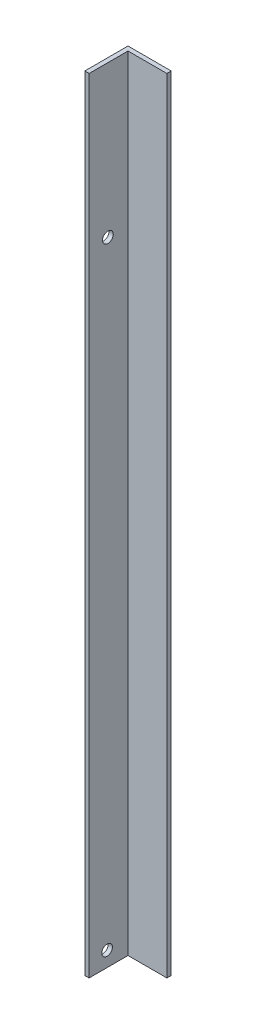
ISO-10303-21;
HEADER;
FILE_DESCRIPTION(('STEP AP214'),'2;1');
FILE_NAME('part.step','',(''),(''),'','','');
FILE_SCHEMA(('AUTOMOTIVE_DESIGN { 1 0 10303 214 1 1 1 1 }'));
ENDSEC;
DATA;
#1=APPLICATION_CONTEXT('core data for automotive mechanical design processes');
#2=APPLICATION_PROTOCOL_DEFINITION('international standard','automotive_design',2000,#1);
#3=PRODUCT_CONTEXT('',#1,'mechanical');
#4=PRODUCT('Part','Part','',(#3));
#5=PRODUCT_RELATED_PRODUCT_CATEGORY('part','',(#4));
#6=PRODUCT_DEFINITION_FORMATION('','',#4);
#7=PRODUCT_DEFINITION_CONTEXT('part definition',#1,'design');
#8=PRODUCT_DEFINITION('design','',#6,#7);
#9=PRODUCT_DEFINITION_SHAPE('','',#8);
#10=(LENGTH_UNIT() NAMED_UNIT(*) SI_UNIT(.MILLI.,.METRE.));
#11=(NAMED_UNIT(*) PLANE_ANGLE_UNIT() SI_UNIT($,.RADIAN.));
#12=(NAMED_UNIT(*) SI_UNIT($,.STERADIAN.) SOLID_ANGLE_UNIT());
#13=UNCERTAINTY_MEASURE_WITH_UNIT(LENGTH_MEASURE(1.E-05),#10,'distance_accuracy_value','');
#14=(GEOMETRIC_REPRESENTATION_CONTEXT(3) GLOBAL_UNCERTAINTY_ASSIGNED_CONTEXT((#13)) GLOBAL_UNIT_ASSIGNED_CONTEXT((#10,
#11,#12)) REPRESENTATION_CONTEXT('',''));
#15=CARTESIAN_POINT('',(0.,0.,0.));
#16=DIRECTION('',(0.,0.,1.));
#17=DIRECTION('',(1.,0.,0.));
#18=AXIS2_PLACEMENT_3D('',#15,#16,#17);
#19=CARTESIAN_POINT('',(-24.9936,460.375,-15.0368));
#20=DIRECTION('',(0.,0.,-1.));
#21=DIRECTION('',(-1.,0.,0.));
#22=AXIS2_PLACEMENT_3D('',#19,#20,#21);
#23=PLANE('',#22);
#24=DIRECTION('',(1.,0.,0.));
#25=VECTOR('',#24,1.);
#26=CARTESIAN_POINT('',(-24.9936,0.,-15.0368));
#27=LINE('',#26,#25);
#28=CARTESIAN_POINT('',(-22.4536,0.,-15.0368));
#29=VERTEX_POINT('',#28);
#30=CARTESIAN_POINT('',(0.406400000000005,0.,-15.0368));
#31=VERTEX_POINT('',#30);
#32=EDGE_CURVE('E113',#29,#31,#27,.T.);
#33=ORIENTED_EDGE('',*,*,#32,.T.);
#34=DIRECTION('',(0.,-1.,0.));
#35=VECTOR('',#34,1.);
#36=CARTESIAN_POINT('',(0.406400000000005,460.375,-15.0368));
#37=LINE('',#36,#35);
#38=CARTESIAN_POINT('',(0.406400000000005,460.375,-15.0368));
#39=VERTEX_POINT('',#38);
#40=EDGE_CURVE('E11',#39,#31,#37,.T.);
#41=ORIENTED_EDGE('',*,*,#40,.F.);
#42=DIRECTION('',(1.,0.,0.));
#43=VECTOR('',#42,1.);
#44=CARTESIAN_POINT('',(-24.9936,460.375,-15.0368));
#45=LINE('',#44,#43);
#46=CARTESIAN_POINT('',(-22.4536,460.375,-15.0368));
#47=VERTEX_POINT('',#46);
#48=EDGE_CURVE('E78',#47,#39,#45,.T.);
#49=ORIENTED_EDGE('',*,*,#48,.F.);
#50=DIRECTION('',(0.,-1.,0.));
#51=VECTOR('',#50,1.);
#52=CARTESIAN_POINT('',(-22.4536,460.375,-15.0368));
#53=LINE('',#52,#51);
#54=EDGE_CURVE('E109',#47,#29,#53,.T.);
#55=ORIENTED_EDGE('',*,*,#54,.T.);
#56=EDGE_LOOP('',(#33,#41,#49,#55));
#57=FACE_BOUND('',#56,.T.);
#58=ADVANCED_FACE('F32',(#57),#23,.F.);
#59=CARTESIAN_POINT('',(0.406400000000005,460.375,-17.5768));
#60=DIRECTION('',(1.,0.,0.));
#61=DIRECTION('',(0.,0.,-1.));
#62=AXIS2_PLACEMENT_3D('',#59,#60,#61);
#63=PLANE('',#62);
#64=DIRECTION('',(0.,0.,1.));
#65=VECTOR('',#64,1.);
#66=CARTESIAN_POINT('',(0.406400000000005,0.,-17.5768));
#67=LINE('',#66,#65);
#68=CARTESIAN_POINT('',(0.406400000000005,0.,-17.5768));
#69=VERTEX_POINT('',#68);
#70=EDGE_CURVE('E116',#69,#31,#67,.T.);
#71=ORIENTED_EDGE('',*,*,#70,.F.);
#72=DIRECTION('',(0.,-1.,0.));
#73=VECTOR('',#72,1.);
#74=CARTESIAN_POINT('',(0.406400000000005,460.375,-17.5768));
#75=LINE('',#74,#73);
#76=CARTESIAN_POINT('',(0.406400000000005,460.375,-17.5768));
#77=VERTEX_POINT('',#76);
#78=EDGE_CURVE('E40',#77,#69,#75,.T.);
#79=ORIENTED_EDGE('',*,*,#78,.F.);
#80=DIRECTION('',(0.,0.,1.));
#81=VECTOR('',#80,1.);
#82=CARTESIAN_POINT('',(0.406400000000005,460.375,-17.5768));
#83=LINE('',#82,#81);
#84=EDGE_CURVE('E182',#77,#39,#83,.T.);
#85=ORIENTED_EDGE('',*,*,#84,.T.);
#86=ORIENTED_EDGE('',*,*,#40,.T.);
#87=EDGE_LOOP('',(#71,#79,#85,#86));
#88=FACE_BOUND('',#87,.T.);
#89=ADVANCED_FACE('F135',(#88),#63,.T.);
#90=CARTESIAN_POINT('',(-24.9936,460.375,-17.5768));
#91=DIRECTION('',(0.,0.,-1.));
#92=DIRECTION('',(-1.,0.,0.));
#93=AXIS2_PLACEMENT_3D('',#90,#91,#92);
#94=PLANE('',#93);
#95=DIRECTION('',(1.,0.,0.));
#96=VECTOR('',#95,1.);
#97=CARTESIAN_POINT('',(-24.9936,0.,-17.5768));
#98=LINE('',#97,#96);
#99=CARTESIAN_POINT('',(-24.9936,0.,-17.5768));
#100=VERTEX_POINT('',#99);
#101=EDGE_CURVE('E120',#100,#69,#98,.T.);
#102=ORIENTED_EDGE('',*,*,#101,.F.);
#103=DIRECTION('',(0.,-1.,0.));
#104=VECTOR('',#103,1.);
#105=CARTESIAN_POINT('',(-24.9936,460.375,-17.5768));
#106=LINE('',#105,#104);
#107=CARTESIAN_POINT('',(-24.9936,460.375,-17.5768));
#108=VERTEX_POINT('',#107);
#109=EDGE_CURVE('E99',#108,#100,#106,.T.);
#110=ORIENTED_EDGE('',*,*,#109,.F.);
#111=DIRECTION('',(1.,0.,0.));
#112=VECTOR('',#111,1.);
#113=CARTESIAN_POINT('',(-24.9936,460.375,-17.5768));
#114=LINE('',#113,#112);
#115=EDGE_CURVE('E105',#108,#77,#114,.T.);
#116=ORIENTED_EDGE('',*,*,#115,.T.);
#117=ORIENTED_EDGE('',*,*,#78,.T.);
#118=EDGE_LOOP('',(#102,#110,#116,#117));
#119=FACE_BOUND('',#118,.T.);
#120=ADVANCED_FACE('F132',(#119),#94,.T.);
#121=CARTESIAN_POINT('',(-24.9936,460.375,7.8232));
#122=DIRECTION('',(-1.,0.,0.));
#123=DIRECTION('',(0.,0.,1.));
#124=AXIS2_PLACEMENT_3D('',#121,#122,#123);
#125=PLANE('',#124);
#126=CARTESIAN_POINT('',(-24.9936,8.89,-2.7617839705556));
#127=DIRECTION('',(1.,0.,0.));
#128=DIRECTION('',(0.,0.,-1.));
#129=AXIS2_PLACEMENT_3D('',#126,#127,#128);
#130=CIRCLE('',#129,3.1119196311522);
#131=CARTESIAN_POINT('',(-24.9936,8.89,-5.8737036017078));
#132=VERTEX_POINT('',#131);
#133=EDGE_CURVE('E169',#132,#132,#130,.T.);
#134=ORIENTED_EDGE('',*,*,#133,.T.);
#135=EDGE_LOOP('',(#134));
#136=FACE_BOUND('',#135,.T.);
#137=CARTESIAN_POINT('',(-24.9936,371.475,-3.20583492134574));
#138=DIRECTION('',(1.,0.,0.));
#139=DIRECTION('',(0.,0.,-1.));
#140=AXIS2_PLACEMENT_3D('',#137,#138,#139);
#141=CIRCLE('',#140,3.175);
#142=CARTESIAN_POINT('',(-24.9936,371.475,-6.38083492134574));
#143=VERTEX_POINT('',#142);
#144=EDGE_CURVE('E117',#143,#143,#141,.T.);
#145=ORIENTED_EDGE('',*,*,#144,.T.);
#146=EDGE_LOOP('',(#145));
#147=FACE_BOUND('',#146,.T.);
#148=DIRECTION('',(0.,0.,-1.));
#149=VECTOR('',#148,1.);
#150=CARTESIAN_POINT('',(-24.9936,0.,7.8232));
#151=LINE('',#150,#149);
#152=CARTESIAN_POINT('',(-24.9936,0.,7.8232));
#153=VERTEX_POINT('',#152);
#154=EDGE_CURVE('E94',#153,#100,#151,.T.);
#155=ORIENTED_EDGE('',*,*,#154,.F.);
#156=DIRECTION('',(0.,-1.,0.));
#157=VECTOR('',#156,1.);
#158=CARTESIAN_POINT('',(-24.9936,460.375,7.8232));
#159=LINE('',#158,#157);
#160=CARTESIAN_POINT('',(-24.9936,460.375,7.8232));
#161=VERTEX_POINT('',#160);
#162=EDGE_CURVE('E89',#161,#153,#159,.T.);
#163=ORIENTED_EDGE('',*,*,#162,.F.);
#164=DIRECTION('',(0.,0.,-1.));
#165=VECTOR('',#164,1.);
#166=CARTESIAN_POINT('',(-24.9936,460.375,7.8232));
#167=LINE('',#166,#165);
#168=EDGE_CURVE('E92',#161,#108,#167,.T.);
#169=ORIENTED_EDGE('',*,*,#168,.T.);
#170=ORIENTED_EDGE('',*,*,#109,.T.);
#171=EDGE_LOOP('',(#155,#163,#169,#170));
#172=FACE_BOUND('',#171,.T.);
#173=ADVANCED_FACE('F91',(#136,#147,#172),#125,.T.);
#174=CARTESIAN_POINT('',(-22.4536,460.375,7.8232));
#175=DIRECTION('',(0.,0.,1.));
#176=DIRECTION('',(1.,0.,0.));
#177=AXIS2_PLACEMENT_3D('',#174,#175,#176);
#178=PLANE('',#177);
#179=DIRECTION('',(-1.,0.,0.));
#180=VECTOR('',#179,1.);
#181=CARTESIAN_POINT('',(-22.4536,0.,7.8232));
#182=LINE('',#181,#180);
#183=CARTESIAN_POINT('',(-22.4536,0.,7.8232));
#184=VERTEX_POINT('',#183);
#185=EDGE_CURVE('E124',#184,#153,#182,.T.);
#186=ORIENTED_EDGE('',*,*,#185,.F.);
#187=DIRECTION('',(0.,-1.,0.));
#188=VECTOR('',#187,1.);
#189=CARTESIAN_POINT('',(-22.4536,460.375,7.8232));
#190=LINE('',#189,#188);
#191=CARTESIAN_POINT('',(-22.4536,460.375,7.8232));
#192=VERTEX_POINT('',#191);
#193=EDGE_CURVE('E69',#192,#184,#190,.T.);
#194=ORIENTED_EDGE('',*,*,#193,.F.);
#195=DIRECTION('',(-1.,0.,0.));
#196=VECTOR('',#195,1.);
#197=CARTESIAN_POINT('',(-22.4536,460.375,7.8232));
#198=LINE('',#197,#196);
#199=EDGE_CURVE('E103',#192,#161,#198,.T.);
#200=ORIENTED_EDGE('',*,*,#199,.T.);
#201=ORIENTED_EDGE('',*,*,#162,.T.);
#202=EDGE_LOOP('',(#186,#194,#200,#201));
#203=FACE_BOUND('',#202,.T.);
#204=ADVANCED_FACE('F107',(#203),#178,.T.);
#205=CARTESIAN_POINT('',(-22.4536,460.375,7.8232));
#206=DIRECTION('',(-1.,0.,0.));
#207=DIRECTION('',(0.,0.,1.));
#208=AXIS2_PLACEMENT_3D('',#205,#206,#207);
#209=PLANE('',#208);
#210=CARTESIAN_POINT('',(-22.4536,8.89,-2.7617839705556));
#211=DIRECTION('',(1.,0.,0.));
#212=DIRECTION('',(0.,0.,-1.));
#213=AXIS2_PLACEMENT_3D('',#210,#211,#212);
#214=CIRCLE('',#213,3.1119196311522);
#215=CARTESIAN_POINT('',(-22.4536,8.89,-5.8737036017078));
#216=VERTEX_POINT('',#215);
#217=EDGE_CURVE('E178',#216,#216,#214,.T.);
#218=ORIENTED_EDGE('',*,*,#217,.F.);
#219=EDGE_LOOP('',(#218));
#220=FACE_BOUND('',#219,.T.);
#221=CARTESIAN_POINT('',(-22.4536,371.475,-3.20583492134574));
#222=DIRECTION('',(1.,0.,0.));
#223=DIRECTION('',(0.,0.,-1.));
#224=AXIS2_PLACEMENT_3D('',#221,#222,#223);
#225=CIRCLE('',#224,3.175);
#226=CARTESIAN_POINT('',(-22.4536,371.475,-6.38083492134574));
#227=VERTEX_POINT('',#226);
#228=EDGE_CURVE('E173',#227,#227,#225,.T.);
#229=ORIENTED_EDGE('',*,*,#228,.F.);
#230=EDGE_LOOP('',(#229));
#231=FACE_BOUND('',#230,.T.);
#232=DIRECTION('',(0.,0.,-1.));
#233=VECTOR('',#232,1.);
#234=CARTESIAN_POINT('',(-22.4536,0.,7.8232));
#235=LINE('',#234,#233);
#236=EDGE_CURVE('E72',#184,#29,#235,.T.);
#237=ORIENTED_EDGE('',*,*,#236,.T.);
#238=ORIENTED_EDGE('',*,*,#54,.F.);
#239=DIRECTION('',(0.,0.,-1.));
#240=VECTOR('',#239,1.);
#241=CARTESIAN_POINT('',(-22.4536,460.375,7.8232));
#242=LINE('',#241,#240);
#243=EDGE_CURVE('E48',#192,#47,#242,.T.);
#244=ORIENTED_EDGE('',*,*,#243,.F.);
#245=ORIENTED_EDGE('',*,*,#193,.T.);
#246=EDGE_LOOP('',(#237,#238,#244,#245));
#247=FACE_BOUND('',#246,.T.);
#248=ADVANCED_FACE('F140',(#220,#231,#247),#209,.F.);
#249=CARTESIAN_POINT('',(0.,460.375,0.));
#250=DIRECTION('',(0.,-1.,0.));
#251=DIRECTION('',(-1.,0.,0.));
#252=AXIS2_PLACEMENT_3D('',#249,#250,#251);
#253=PLANE('',#252);
#254=ORIENTED_EDGE('',*,*,#48,.T.);
#255=ORIENTED_EDGE('',*,*,#84,.F.);
#256=ORIENTED_EDGE('',*,*,#115,.F.);
#257=ORIENTED_EDGE('',*,*,#168,.F.);
#258=ORIENTED_EDGE('',*,*,#199,.F.);
#259=ORIENTED_EDGE('',*,*,#243,.T.);
#260=EDGE_LOOP('',(#254,#255,#256,#257,#258,#259));
#261=FACE_BOUND('',#260,.T.);
#262=ADVANCED_FACE('F102',(#261),#253,.F.);
#263=CARTESIAN_POINT('',(0.,0.,0.));
#264=DIRECTION('',(0.,-1.,0.));
#265=DIRECTION('',(-1.,0.,0.));
#266=AXIS2_PLACEMENT_3D('',#263,#264,#265);
#267=PLANE('',#266);
#268=ORIENTED_EDGE('',*,*,#32,.F.);
#269=ORIENTED_EDGE('',*,*,#236,.F.);
#270=ORIENTED_EDGE('',*,*,#185,.T.);
#271=ORIENTED_EDGE('',*,*,#154,.T.);
#272=ORIENTED_EDGE('',*,*,#101,.T.);
#273=ORIENTED_EDGE('',*,*,#70,.T.);
#274=EDGE_LOOP('',(#268,#269,#270,#271,#272,#273));
#275=FACE_BOUND('',#274,.T.);
#276=ADVANCED_FACE('F138',(#275),#267,.T.);
#277=CARTESIAN_POINT('',(-24.9936,371.475,-3.20583492134574));
#278=DIRECTION('',(1.,0.,0.));
#279=DIRECTION('',(0.,0.,-1.));
#280=AXIS2_PLACEMENT_3D('',#277,#278,#279);
#281=CYLINDRICAL_SURFACE('',#280,3.175);
#282=ORIENTED_EDGE('',*,*,#144,.F.);
#283=EDGE_LOOP('',(#282));
#284=FACE_BOUND('',#283,.T.);
#285=ORIENTED_EDGE('',*,*,#228,.T.);
#286=EDGE_LOOP('',(#285));
#287=FACE_BOUND('',#286,.T.);
#288=ADVANCED_FACE('F187',(#284,#287),#281,.F.);
#289=CARTESIAN_POINT('',(-24.9936,8.89,-2.7617839705556));
#290=DIRECTION('',(1.,0.,0.));
#291=DIRECTION('',(0.,0.,-1.));
#292=AXIS2_PLACEMENT_3D('',#289,#290,#291);
#293=CYLINDRICAL_SURFACE('',#292,3.1119196311522);
#294=ORIENTED_EDGE('',*,*,#133,.F.);
#295=EDGE_LOOP('',(#294));
#296=FACE_BOUND('',#295,.T.);
#297=ORIENTED_EDGE('',*,*,#217,.T.);
#298=EDGE_LOOP('',(#297));
#299=FACE_BOUND('',#298,.T.);
#300=ADVANCED_FACE('F185',(#296,#299),#293,.F.);
#301=CLOSED_SHELL('',(#58,#89,#120,#173,#204,#248,#262,#276,#288,#300));
#302=MANIFOLD_SOLID_BREP('B2',#301);
#303=ADVANCED_BREP_SHAPE_REPRESENTATION('',(#18,#302),#14);
#304=SHAPE_DEFINITION_REPRESENTATION(#9,#303);
ENDSEC;
END-ISO-10303-21;
